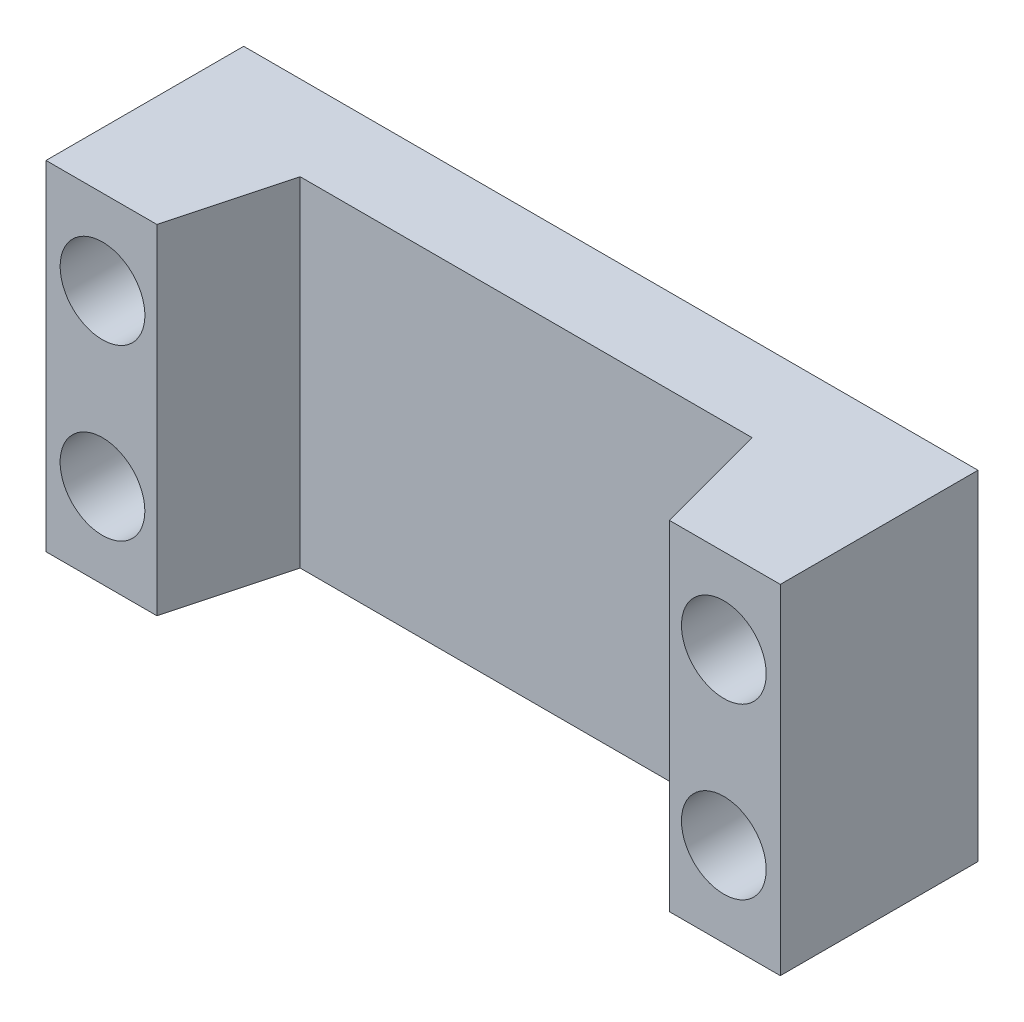
ISO-10303-21;
HEADER;
FILE_DESCRIPTION(('STEP AP214'),'2;1');
FILE_NAME('part.step','',(''),(''),'','','');
FILE_SCHEMA(('AUTOMOTIVE_DESIGN { 1 0 10303 214 1 1 1 1 }'));
ENDSEC;
DATA;
#1=APPLICATION_CONTEXT('core data for automotive mechanical design processes');
#2=APPLICATION_PROTOCOL_DEFINITION('international standard','automotive_design',2000,#1);
#3=PRODUCT_CONTEXT('',#1,'mechanical');
#4=PRODUCT('Part','Part','',(#3));
#5=PRODUCT_RELATED_PRODUCT_CATEGORY('part','',(#4));
#6=PRODUCT_DEFINITION_FORMATION('','',#4);
#7=PRODUCT_DEFINITION_CONTEXT('part definition',#1,'design');
#8=PRODUCT_DEFINITION('design','',#6,#7);
#9=PRODUCT_DEFINITION_SHAPE('','',#8);
#10=(LENGTH_UNIT() NAMED_UNIT(*) SI_UNIT(.MILLI.,.METRE.));
#11=(NAMED_UNIT(*) PLANE_ANGLE_UNIT() SI_UNIT($,.RADIAN.));
#12=(NAMED_UNIT(*) SI_UNIT($,.STERADIAN.) SOLID_ANGLE_UNIT());
#13=UNCERTAINTY_MEASURE_WITH_UNIT(LENGTH_MEASURE(1.E-05),#10,'distance_accuracy_value','');
#14=(GEOMETRIC_REPRESENTATION_CONTEXT(3) GLOBAL_UNCERTAINTY_ASSIGNED_CONTEXT((#13)) GLOBAL_UNIT_ASSIGNED_CONTEXT((#10,
#11,#12)) REPRESENTATION_CONTEXT('',''));
#15=CARTESIAN_POINT('',(0.,0.,0.));
#16=DIRECTION('',(0.,0.,1.));
#17=DIRECTION('',(1.,0.,0.));
#18=AXIS2_PLACEMENT_3D('',#15,#16,#17);
#19=CARTESIAN_POINT('',(-8.46410161513771,12.,-2.267949192431));
#20=DIRECTION('',(0.965925826289073,0.,0.258819045102508));
#21=DIRECTION('',(0.258819045102508,0.,-0.965925826289073));
#22=AXIS2_PLACEMENT_3D('',#19,#20,#21);
#23=PLANE('',#22);
#24=DIRECTION('',(-0.258819045102508,0.,0.965925826289073));
#25=VECTOR('',#24,1.);
#26=CARTESIAN_POINT('',(-8.46410161513771,0.,-2.26794919243099));
#27=LINE('',#26,#25);
#28=CARTESIAN_POINT('',(-7.99999999999997,0.,-3.99999999999995));
#29=VERTEX_POINT('',#28);
#30=CARTESIAN_POINT('',(-9.07179676972441,0.,-1.38777878078145E-13));
#31=VERTEX_POINT('',#30);
#32=EDGE_CURVE('E142',#29,#31,#27,.T.);
#33=ORIENTED_EDGE('',*,*,#32,.F.);
#34=DIRECTION('',(0.,-1.,0.));
#35=VECTOR('',#34,1.);
#36=CARTESIAN_POINT('',(-7.99999999999997,12.,-3.99999999999995));
#37=LINE('',#36,#35);
#38=CARTESIAN_POINT('',(-7.99999999999997,12.,-3.99999999999995));
#39=VERTEX_POINT('',#38);
#40=EDGE_CURVE('E12',#39,#29,#37,.T.);
#41=ORIENTED_EDGE('',*,*,#40,.F.);
#42=DIRECTION('',(-0.258819045102508,0.,0.965925826289073));
#43=VECTOR('',#42,1.);
#44=CARTESIAN_POINT('',(-8.46410161513771,12.,-2.267949192431));
#45=LINE('',#44,#43);
#46=CARTESIAN_POINT('',(-9.0717967697244,12.,-1.51788304147971E-13));
#47=VERTEX_POINT('',#46);
#48=EDGE_CURVE('E158',#39,#47,#45,.T.);
#49=ORIENTED_EDGE('',*,*,#48,.T.);
#50=DIRECTION('',(0.,-1.,0.));
#51=VECTOR('',#50,1.);
#52=CARTESIAN_POINT('',(-9.0717967697244,12.,-1.51788304147971E-13));
#53=LINE('',#52,#51);
#54=EDGE_CURVE('E95',#47,#31,#53,.T.);
#55=ORIENTED_EDGE('',*,*,#54,.T.);
#56=EDGE_LOOP('',(#33,#41,#49,#55));
#57=FACE_BOUND('',#56,.T.);
#58=ADVANCED_FACE('F46',(#57),#23,.T.);
#59=CARTESIAN_POINT('',(0.,12.,-3.99999999999998));
#60=DIRECTION('',(0.,0.,-1.));
#61=DIRECTION('',(-1.,0.,0.));
#62=AXIS2_PLACEMENT_3D('',#59,#60,#61);
#63=PLANE('',#62);
#64=DIRECTION('',(1.,0.,0.));
#65=VECTOR('',#64,1.);
#66=CARTESIAN_POINT('',(0.,0.,-3.99999999999998));
#67=LINE('',#66,#65);
#68=CARTESIAN_POINT('',(8.00000000000002,0.,-4.00000000000001));
#69=VERTEX_POINT('',#68);
#70=EDGE_CURVE('E145',#29,#69,#67,.T.);
#71=ORIENTED_EDGE('',*,*,#70,.T.);
#72=DIRECTION('',(0.,-1.,0.));
#73=VECTOR('',#72,1.);
#74=CARTESIAN_POINT('',(8.00000000000003,12.,-4.00000000000001));
#75=LINE('',#74,#73);
#76=CARTESIAN_POINT('',(8.00000000000003,12.,-4.00000000000001));
#77=VERTEX_POINT('',#76);
#78=EDGE_CURVE('E53',#77,#69,#75,.T.);
#79=ORIENTED_EDGE('',*,*,#78,.F.);
#80=DIRECTION('',(1.,0.,0.));
#81=VECTOR('',#80,1.);
#82=CARTESIAN_POINT('',(0.,12.,-3.99999999999998));
#83=LINE('',#82,#81);
#84=EDGE_CURVE('E136',#39,#77,#83,.T.);
#85=ORIENTED_EDGE('',*,*,#84,.F.);
#86=ORIENTED_EDGE('',*,*,#40,.T.);
#87=EDGE_LOOP('',(#71,#79,#85,#86));
#88=FACE_BOUND('',#87,.T.);
#89=ADVANCED_FACE('F254',(#88),#63,.F.);
#90=CARTESIAN_POINT('',(8.46410161513778,12.,-2.26794919243108));
#91=DIRECTION('',(0.965925826289071,0.,-0.258819045102515));
#92=DIRECTION('',(-0.258819045102515,0.,-0.965925826289071));
#93=AXIS2_PLACEMENT_3D('',#90,#91,#92);
#94=PLANE('',#93);
#95=DIRECTION('',(0.258819045102515,0.,0.965925826289071));
#96=VECTOR('',#95,1.);
#97=CARTESIAN_POINT('',(8.46410161513778,0.,-2.26794919243108));
#98=LINE('',#97,#96);
#99=CARTESIAN_POINT('',(9.07179676972449,0.,0.));
#100=VERTEX_POINT('',#99);
#101=EDGE_CURVE('E148',#69,#100,#98,.T.);
#102=ORIENTED_EDGE('',*,*,#101,.T.);
#103=DIRECTION('',(0.,-1.,0.));
#104=VECTOR('',#103,1.);
#105=CARTESIAN_POINT('',(9.0717967697245,12.,0.));
#106=LINE('',#105,#104);
#107=CARTESIAN_POINT('',(9.0717967697245,12.,0.));
#108=VERTEX_POINT('',#107);
#109=EDGE_CURVE('E128',#108,#100,#106,.T.);
#110=ORIENTED_EDGE('',*,*,#109,.F.);
#111=DIRECTION('',(0.258819045102515,0.,0.965925826289071));
#112=VECTOR('',#111,1.);
#113=CARTESIAN_POINT('',(8.46410161513778,12.,-2.26794919243108));
#114=LINE('',#113,#112);
#115=EDGE_CURVE('E133',#77,#108,#114,.T.);
#116=ORIENTED_EDGE('',*,*,#115,.F.);
#117=ORIENTED_EDGE('',*,*,#78,.T.);
#118=EDGE_LOOP('',(#102,#110,#116,#117));
#119=FACE_BOUND('',#118,.T.);
#120=ADVANCED_FACE('F166',(#119),#94,.F.);
#121=CARTESIAN_POINT('',(0.,12.,0.));
#122=DIRECTION('',(0.,0.,1.));
#123=DIRECTION('',(1.,0.,0.));
#124=AXIS2_PLACEMENT_3D('',#121,#122,#123);
#125=PLANE('',#124);
#126=CARTESIAN_POINT('',(11.,9.00000000000001,0.));
#127=DIRECTION('',(0.,0.,-1.));
#128=DIRECTION('',(1.,0.,0.));
#129=AXIS2_PLACEMENT_3D('',#126,#127,#128);
#130=CIRCLE('',#129,1.5);
#131=CARTESIAN_POINT('',(12.5,9.00000000000001,0.));
#132=VERTEX_POINT('',#131);
#133=EDGE_CURVE('E208',#132,#132,#130,.T.);
#134=ORIENTED_EDGE('',*,*,#133,.T.);
#135=EDGE_LOOP('',(#134));
#136=FACE_BOUND('',#135,.T.);
#137=CARTESIAN_POINT('',(11.,3.,0.));
#138=DIRECTION('',(0.,0.,-1.));
#139=DIRECTION('',(-1.,0.,0.));
#140=AXIS2_PLACEMENT_3D('',#137,#138,#139);
#141=CIRCLE('',#140,1.5);
#142=CARTESIAN_POINT('',(9.50000000000004,3.,0.));
#143=VERTEX_POINT('',#142);
#144=EDGE_CURVE('E180',#143,#143,#141,.T.);
#145=ORIENTED_EDGE('',*,*,#144,.T.);
#146=EDGE_LOOP('',(#145));
#147=FACE_BOUND('',#146,.T.);
#148=DIRECTION('',(-1.,0.,0.));
#149=VECTOR('',#148,1.);
#150=CARTESIAN_POINT('',(0.,0.,0.));
#151=LINE('',#150,#149);
#152=CARTESIAN_POINT('',(13.,0.,0.));
#153=VERTEX_POINT('',#152);
#154=EDGE_CURVE('E127',#153,#100,#151,.T.);
#155=ORIENTED_EDGE('',*,*,#154,.F.);
#156=DIRECTION('',(0.,-1.,0.));
#157=VECTOR('',#156,1.);
#158=CARTESIAN_POINT('',(13.,12.,0.));
#159=LINE('',#158,#157);
#160=CARTESIAN_POINT('',(13.,12.,0.));
#161=VERTEX_POINT('',#160);
#162=EDGE_CURVE('E116',#161,#153,#159,.T.);
#163=ORIENTED_EDGE('',*,*,#162,.F.);
#164=DIRECTION('',(-1.,0.,0.));
#165=VECTOR('',#164,1.);
#166=CARTESIAN_POINT('',(0.,12.,0.));
#167=LINE('',#166,#165);
#168=EDGE_CURVE('E121',#161,#108,#167,.T.);
#169=ORIENTED_EDGE('',*,*,#168,.T.);
#170=ORIENTED_EDGE('',*,*,#109,.T.);
#171=EDGE_LOOP('',(#155,#163,#169,#170));
#172=FACE_BOUND('',#171,.T.);
#173=ADVANCED_FACE('F125',(#136,#147,#172),#125,.T.);
#174=CARTESIAN_POINT('',(13.,12.,0.));
#175=DIRECTION('',(1.,0.,0.));
#176=DIRECTION('',(0.,0.,-1.));
#177=AXIS2_PLACEMENT_3D('',#174,#175,#176);
#178=PLANE('',#177);
#179=DIRECTION('',(0.,-1.,0.));
#180=VECTOR('',#179,1.);
#181=CARTESIAN_POINT('',(13.,0.,-7.00000000000002));
#182=LINE('',#181,#180);
#183=CARTESIAN_POINT('',(13.,12.,-7.00000000000001));
#184=VERTEX_POINT('',#183);
#185=CARTESIAN_POINT('',(13.,0.,-7.00000000000002));
#186=VERTEX_POINT('',#185);
#187=EDGE_CURVE('E60',#184,#186,#182,.T.);
#188=ORIENTED_EDGE('',*,*,#187,.F.);
#189=DIRECTION('',(0.,0.,1.));
#190=VECTOR('',#189,1.);
#191=CARTESIAN_POINT('',(13.,12.,0.));
#192=LINE('',#191,#190);
#193=EDGE_CURVE('E112',#184,#161,#192,.T.);
#194=ORIENTED_EDGE('',*,*,#193,.T.);
#195=ORIENTED_EDGE('',*,*,#162,.T.);
#196=DIRECTION('',(0.,0.,1.));
#197=VECTOR('',#196,1.);
#198=CARTESIAN_POINT('',(13.,0.,0.));
#199=LINE('',#198,#197);
#200=EDGE_CURVE('E151',#186,#153,#199,.T.);
#201=ORIENTED_EDGE('',*,*,#200,.F.);
#202=EDGE_LOOP('',(#188,#194,#195,#201));
#203=FACE_BOUND('',#202,.T.);
#204=ADVANCED_FACE('F114',(#203),#178,.T.);
#205=CARTESIAN_POINT('',(-13.,12.,0.));
#206=DIRECTION('',(1.,0.,0.));
#207=DIRECTION('',(0.,0.,-1.));
#208=AXIS2_PLACEMENT_3D('',#205,#206,#207);
#209=PLANE('',#208);
#210=DIRECTION('',(0.,0.,1.));
#211=VECTOR('',#210,1.);
#212=CARTESIAN_POINT('',(-13.,12.,0.));
#213=LINE('',#212,#211);
#214=CARTESIAN_POINT('',(-13.,12.,-7.));
#215=VERTEX_POINT('',#214);
#216=CARTESIAN_POINT('',(-13.,12.,-2.03830008427275E-13));
#217=VERTEX_POINT('',#216);
#218=EDGE_CURVE('E120',#215,#217,#213,.T.);
#219=ORIENTED_EDGE('',*,*,#218,.F.);
#220=DIRECTION('',(0.,1.,0.));
#221=VECTOR('',#220,1.);
#222=CARTESIAN_POINT('',(-13.,0.,-7.00000000000002));
#223=LINE('',#222,#221);
#224=CARTESIAN_POINT('',(-13.,0.,-7.00000000000002));
#225=VERTEX_POINT('',#224);
#226=EDGE_CURVE('E177',#225,#215,#223,.T.);
#227=ORIENTED_EDGE('',*,*,#226,.F.);
#228=DIRECTION('',(0.,0.,1.));
#229=VECTOR('',#228,1.);
#230=CARTESIAN_POINT('',(-13.,0.,0.));
#231=LINE('',#230,#229);
#232=CARTESIAN_POINT('',(-13.,0.,-2.02962646689286E-13));
#233=VERTEX_POINT('',#232);
#234=EDGE_CURVE('E154',#225,#233,#231,.T.);
#235=ORIENTED_EDGE('',*,*,#234,.T.);
#236=DIRECTION('',(0.,-1.,0.));
#237=VECTOR('',#236,1.);
#238=CARTESIAN_POINT('',(-13.,12.,-2.03830008427275E-13));
#239=LINE('',#238,#237);
#240=EDGE_CURVE('E129',#217,#233,#239,.T.);
#241=ORIENTED_EDGE('',*,*,#240,.F.);
#242=EDGE_LOOP('',(#219,#227,#235,#241));
#243=FACE_BOUND('',#242,.T.);
#244=ADVANCED_FACE('F261',(#243),#209,.F.);
#245=CARTESIAN_POINT('',(0.,12.,0.));
#246=DIRECTION('',(0.,0.,-1.));
#247=DIRECTION('',(-1.,0.,0.));
#248=AXIS2_PLACEMENT_3D('',#245,#246,#247);
#249=PLANE('',#248);
#250=CARTESIAN_POINT('',(-11.,8.9999999999999,0.));
#251=DIRECTION('',(0.,0.,-1.));
#252=DIRECTION('',(-1.,0.,0.));
#253=AXIS2_PLACEMENT_3D('',#250,#251,#252);
#254=CIRCLE('',#253,1.5);
#255=CARTESIAN_POINT('',(-12.5,8.9999999999999,0.));
#256=VERTEX_POINT('',#255);
#257=EDGE_CURVE('E215',#256,#256,#254,.T.);
#258=ORIENTED_EDGE('',*,*,#257,.T.);
#259=EDGE_LOOP('',(#258));
#260=FACE_BOUND('',#259,.T.);
#261=CARTESIAN_POINT('',(-11.,3.00000000000004,0.));
#262=DIRECTION('',(0.,0.,-1.));
#263=DIRECTION('',(1.,0.,0.));
#264=AXIS2_PLACEMENT_3D('',#261,#262,#263);
#265=CIRCLE('',#264,1.5);
#266=CARTESIAN_POINT('',(-9.50000000000002,3.00000000000004,0.));
#267=VERTEX_POINT('',#266);
#268=EDGE_CURVE('E199',#267,#267,#265,.T.);
#269=ORIENTED_EDGE('',*,*,#268,.T.);
#270=EDGE_LOOP('',(#269));
#271=FACE_BOUND('',#270,.T.);
#272=DIRECTION('',(1.,0.,0.));
#273=VECTOR('',#272,1.);
#274=CARTESIAN_POINT('',(0.,0.,0.));
#275=LINE('',#274,#273);
#276=EDGE_CURVE('E156',#233,#31,#275,.T.);
#277=ORIENTED_EDGE('',*,*,#276,.T.);
#278=ORIENTED_EDGE('',*,*,#54,.F.);
#279=DIRECTION('',(1.,0.,0.));
#280=VECTOR('',#279,1.);
#281=CARTESIAN_POINT('',(0.,12.,0.));
#282=LINE('',#281,#280);
#283=EDGE_CURVE('E69',#217,#47,#282,.T.);
#284=ORIENTED_EDGE('',*,*,#283,.F.);
#285=ORIENTED_EDGE('',*,*,#240,.T.);
#286=EDGE_LOOP('',(#277,#278,#284,#285));
#287=FACE_BOUND('',#286,.T.);
#288=ADVANCED_FACE('F228',(#260,#271,#287),#249,.F.);
#289=CARTESIAN_POINT('',(0.,12.,0.));
#290=DIRECTION('',(0.,1.,0.));
#291=DIRECTION('',(0.,0.,1.));
#292=AXIS2_PLACEMENT_3D('',#289,#290,#291);
#293=PLANE('',#292);
#294=DIRECTION('',(1.,0.,0.));
#295=VECTOR('',#294,1.);
#296=CARTESIAN_POINT('',(13.,12.,-7.00000000000001));
#297=LINE('',#296,#295);
#298=EDGE_CURVE('E146',#215,#184,#297,.T.);
#299=ORIENTED_EDGE('',*,*,#298,.F.);
#300=ORIENTED_EDGE('',*,*,#218,.T.);
#301=ORIENTED_EDGE('',*,*,#283,.T.);
#302=ORIENTED_EDGE('',*,*,#48,.F.);
#303=ORIENTED_EDGE('',*,*,#84,.T.);
#304=ORIENTED_EDGE('',*,*,#115,.T.);
#305=ORIENTED_EDGE('',*,*,#168,.F.);
#306=ORIENTED_EDGE('',*,*,#193,.F.);
#307=EDGE_LOOP('',(#299,#300,#301,#302,#303,#304,#305,#306));
#308=FACE_BOUND('',#307,.T.);
#309=ADVANCED_FACE('F131',(#308),#293,.T.);
#310=CARTESIAN_POINT('',(0.,0.,0.));
#311=DIRECTION('',(0.,1.,0.));
#312=DIRECTION('',(0.,0.,1.));
#313=AXIS2_PLACEMENT_3D('',#310,#311,#312);
#314=PLANE('',#313);
#315=ORIENTED_EDGE('',*,*,#234,.F.);
#316=DIRECTION('',(-1.,0.,0.));
#317=VECTOR('',#316,1.);
#318=CARTESIAN_POINT('',(13.,0.,-7.00000000000002));
#319=LINE('',#318,#317);
#320=EDGE_CURVE('E172',#186,#225,#319,.T.);
#321=ORIENTED_EDGE('',*,*,#320,.F.);
#322=ORIENTED_EDGE('',*,*,#200,.T.);
#323=ORIENTED_EDGE('',*,*,#154,.T.);
#324=ORIENTED_EDGE('',*,*,#101,.F.);
#325=ORIENTED_EDGE('',*,*,#70,.F.);
#326=ORIENTED_EDGE('',*,*,#32,.T.);
#327=ORIENTED_EDGE('',*,*,#276,.F.);
#328=EDGE_LOOP('',(#315,#321,#322,#323,#324,#325,#326,#327));
#329=FACE_BOUND('',#328,.T.);
#330=ADVANCED_FACE('F171',(#329),#314,.F.);
#331=CARTESIAN_POINT('',(0.,0.,-7.00000000000001));
#332=DIRECTION('',(0.,0.,1.));
#333=DIRECTION('',(1.,0.,0.));
#334=AXIS2_PLACEMENT_3D('',#331,#332,#333);
#335=PLANE('',#334);
#336=CARTESIAN_POINT('',(11.,9.00000000000001,-7.00000000000001));
#337=DIRECTION('',(0.,0.,-1.));
#338=DIRECTION('',(1.,0.,0.));
#339=AXIS2_PLACEMENT_3D('',#336,#337,#338);
#340=CIRCLE('',#339,1.5);
#341=CARTESIAN_POINT('',(12.5,9.00000000000001,-7.00000000000001));
#342=VERTEX_POINT('',#341);
#343=EDGE_CURVE('E204',#342,#342,#340,.T.);
#344=ORIENTED_EDGE('',*,*,#343,.F.);
#345=EDGE_LOOP('',(#344));
#346=FACE_BOUND('',#345,.T.);
#347=CARTESIAN_POINT('',(-11.,8.9999999999999,-7.00000000000001));
#348=DIRECTION('',(0.,0.,-1.));
#349=DIRECTION('',(-1.,0.,0.));
#350=AXIS2_PLACEMENT_3D('',#347,#348,#349);
#351=CIRCLE('',#350,1.5);
#352=CARTESIAN_POINT('',(-12.5,8.9999999999999,-7.00000000000001));
#353=VERTEX_POINT('',#352);
#354=EDGE_CURVE('E211',#353,#353,#351,.T.);
#355=ORIENTED_EDGE('',*,*,#354,.F.);
#356=EDGE_LOOP('',(#355));
#357=FACE_BOUND('',#356,.T.);
#358=CARTESIAN_POINT('',(-11.,3.00000000000004,-7.));
#359=DIRECTION('',(0.,0.,-1.));
#360=DIRECTION('',(1.,0.,0.));
#361=AXIS2_PLACEMENT_3D('',#358,#359,#360);
#362=CIRCLE('',#361,1.5);
#363=CARTESIAN_POINT('',(-9.50000000000002,3.00000000000004,-7.));
#364=VERTEX_POINT('',#363);
#365=EDGE_CURVE('E220',#364,#364,#362,.T.);
#366=ORIENTED_EDGE('',*,*,#365,.F.);
#367=EDGE_LOOP('',(#366));
#368=FACE_BOUND('',#367,.T.);
#369=CARTESIAN_POINT('',(11.,3.,-7.00000000000002));
#370=DIRECTION('',(0.,0.,-1.));
#371=DIRECTION('',(-1.,0.,0.));
#372=AXIS2_PLACEMENT_3D('',#369,#370,#371);
#373=CIRCLE('',#372,1.5);
#374=CARTESIAN_POINT('',(9.50000000000002,3.,-7.00000000000002));
#375=VERTEX_POINT('',#374);
#376=EDGE_CURVE('E195',#375,#375,#373,.T.);
#377=ORIENTED_EDGE('',*,*,#376,.F.);
#378=EDGE_LOOP('',(#377));
#379=FACE_BOUND('',#378,.T.);
#380=ORIENTED_EDGE('',*,*,#187,.T.);
#381=ORIENTED_EDGE('',*,*,#320,.T.);
#382=ORIENTED_EDGE('',*,*,#226,.T.);
#383=ORIENTED_EDGE('',*,*,#298,.T.);
#384=EDGE_LOOP('',(#380,#381,#382,#383));
#385=FACE_BOUND('',#384,.T.);
#386=ADVANCED_FACE('F239',(#346,#357,#368,#379,#385),#335,.F.);
#387=CARTESIAN_POINT('',(11.,3.,0.));
#388=DIRECTION('',(0.,0.,-1.));
#389=DIRECTION('',(-1.,0.,0.));
#390=AXIS2_PLACEMENT_3D('',#387,#388,#389);
#391=CYLINDRICAL_SURFACE('',#390,1.5);
#392=ORIENTED_EDGE('',*,*,#144,.F.);
#393=EDGE_LOOP('',(#392));
#394=FACE_BOUND('',#393,.T.);
#395=ORIENTED_EDGE('',*,*,#376,.T.);
#396=EDGE_LOOP('',(#395));
#397=FACE_BOUND('',#396,.T.);
#398=ADVANCED_FACE('F235',(#394,#397),#391,.F.);
#399=CARTESIAN_POINT('',(-11.,3.00000000000004,0.));
#400=DIRECTION('',(0.,0.,-1.));
#401=DIRECTION('',(-1.,0.,0.));
#402=AXIS2_PLACEMENT_3D('',#399,#400,#401);
#403=CYLINDRICAL_SURFACE('',#402,1.5);
#404=ORIENTED_EDGE('',*,*,#268,.F.);
#405=EDGE_LOOP('',(#404));
#406=FACE_BOUND('',#405,.T.);
#407=ORIENTED_EDGE('',*,*,#365,.T.);
#408=EDGE_LOOP('',(#407));
#409=FACE_BOUND('',#408,.T.);
#410=ADVANCED_FACE('F231',(#406,#409),#403,.F.);
#411=CARTESIAN_POINT('',(-11.,8.9999999999999,0.));
#412=DIRECTION('',(0.,0.,-1.));
#413=DIRECTION('',(-1.,0.,0.));
#414=AXIS2_PLACEMENT_3D('',#411,#412,#413);
#415=CYLINDRICAL_SURFACE('',#414,1.5);
#416=ORIENTED_EDGE('',*,*,#257,.F.);
#417=EDGE_LOOP('',(#416));
#418=FACE_BOUND('',#417,.T.);
#419=ORIENTED_EDGE('',*,*,#354,.T.);
#420=EDGE_LOOP('',(#419));
#421=FACE_BOUND('',#420,.T.);
#422=ADVANCED_FACE('F234',(#418,#421),#415,.F.);
#423=CARTESIAN_POINT('',(11.,9.00000000000001,0.));
#424=DIRECTION('',(0.,0.,-1.));
#425=DIRECTION('',(-1.,0.,0.));
#426=AXIS2_PLACEMENT_3D('',#423,#424,#425);
#427=CYLINDRICAL_SURFACE('',#426,1.5);
#428=ORIENTED_EDGE('',*,*,#133,.F.);
#429=EDGE_LOOP('',(#428));
#430=FACE_BOUND('',#429,.T.);
#431=ORIENTED_EDGE('',*,*,#343,.T.);
#432=EDGE_LOOP('',(#431));
#433=FACE_BOUND('',#432,.T.);
#434=ADVANCED_FACE('F326',(#430,#433),#427,.F.);
#435=CLOSED_SHELL('',(#58,#89,#120,#173,#204,#244,#288,#309,#330,#386,#398,#410,#422,#434));
#436=MANIFOLD_SOLID_BREP('B2',#435);
#437=ADVANCED_BREP_SHAPE_REPRESENTATION('',(#18,#436),#14);
#438=SHAPE_DEFINITION_REPRESENTATION(#9,#437);
ENDSEC;
END-ISO-10303-21;
